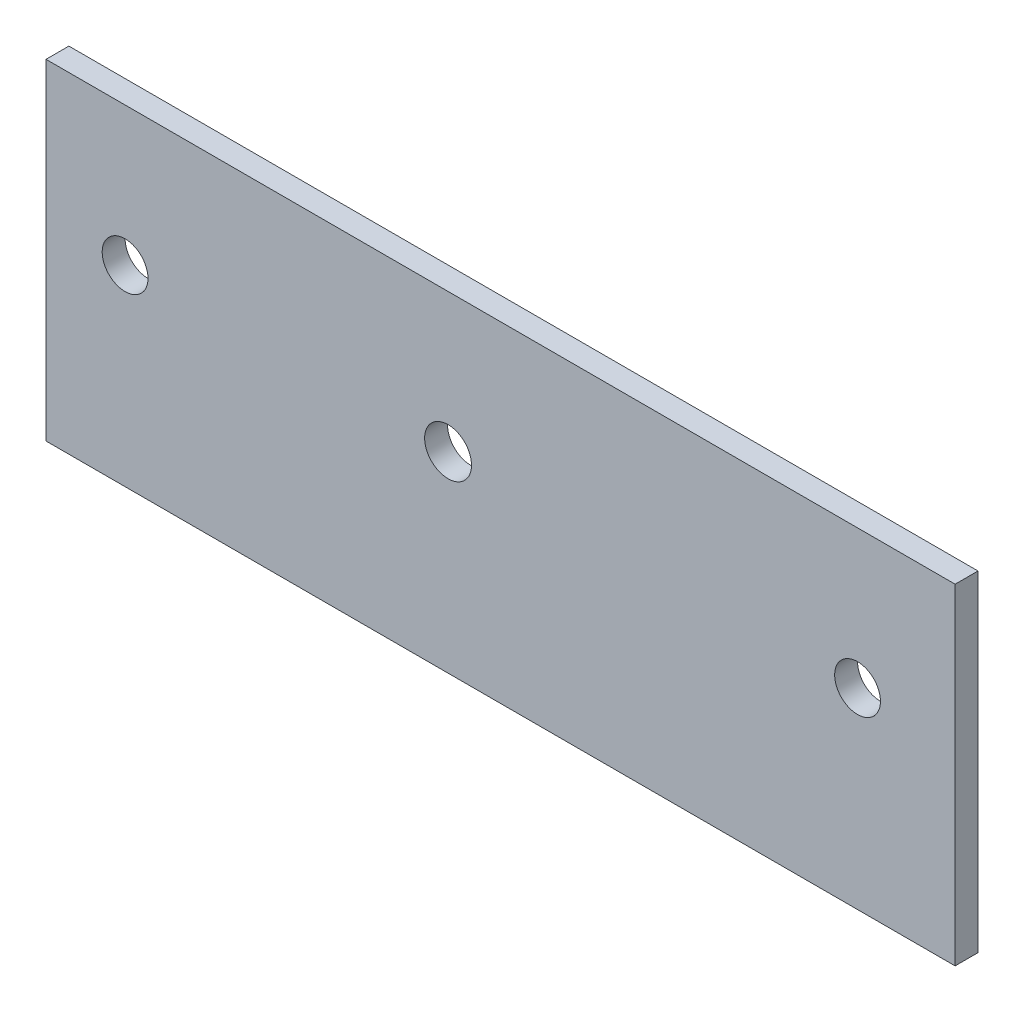
ISO-10303-21;
HEADER;
FILE_DESCRIPTION(('STEP AP214'),'2;1');
FILE_NAME('part.step','',(''),(''),'','','');
FILE_SCHEMA(('AUTOMOTIVE_DESIGN { 1 0 10303 214 1 1 1 1 }'));
ENDSEC;
DATA;
#1=APPLICATION_CONTEXT('core data for automotive mechanical design processes');
#2=APPLICATION_PROTOCOL_DEFINITION('international standard','automotive_design',2000,#1);
#3=PRODUCT_CONTEXT('',#1,'mechanical');
#4=PRODUCT('Part','Part','',(#3));
#5=PRODUCT_RELATED_PRODUCT_CATEGORY('part','',(#4));
#6=PRODUCT_DEFINITION_FORMATION('','',#4);
#7=PRODUCT_DEFINITION_CONTEXT('part definition',#1,'design');
#8=PRODUCT_DEFINITION('design','',#6,#7);
#9=PRODUCT_DEFINITION_SHAPE('','',#8);
#10=(LENGTH_UNIT() NAMED_UNIT(*) SI_UNIT(.MILLI.,.METRE.));
#11=(NAMED_UNIT(*) PLANE_ANGLE_UNIT() SI_UNIT($,.RADIAN.));
#12=(NAMED_UNIT(*) SI_UNIT($,.STERADIAN.) SOLID_ANGLE_UNIT());
#13=UNCERTAINTY_MEASURE_WITH_UNIT(LENGTH_MEASURE(1.E-05),#10,'distance_accuracy_value','');
#14=(GEOMETRIC_REPRESENTATION_CONTEXT(3) GLOBAL_UNCERTAINTY_ASSIGNED_CONTEXT((#13)) GLOBAL_UNIT_ASSIGNED_CONTEXT((#10,
#11,#12)) REPRESENTATION_CONTEXT('',''));
#15=CARTESIAN_POINT('',(0.,0.,0.));
#16=DIRECTION('',(0.,0.,1.));
#17=DIRECTION('',(1.,0.,0.));
#18=AXIS2_PLACEMENT_3D('',#15,#16,#17);
#19=CARTESIAN_POINT('',(0.,0.,3.175));
#20=DIRECTION('',(0.,0.,1.));
#21=DIRECTION('',(1.,0.,0.));
#22=AXIS2_PLACEMENT_3D('',#19,#20,#21);
#23=PLANE('',#22);
#24=CARTESIAN_POINT('',(76.2,5.55111512312578E-13,3.175));
#25=DIRECTION('',(0.,0.,1.));
#26=DIRECTION('',(1.,0.,0.));
#27=AXIS2_PLACEMENT_3D('',#24,#25,#26);
#28=CIRCLE('',#27,3.175);
#29=CARTESIAN_POINT('',(79.375,5.55111512312578E-13,3.175));
#30=VERTEX_POINT('',#29);
#31=EDGE_CURVE('E121',#30,#30,#28,.T.);
#32=ORIENTED_EDGE('',*,*,#31,.F.);
#33=EDGE_LOOP('',(#32));
#34=FACE_BOUND('',#33,.T.);
#35=DIRECTION('',(0.,-1.,0.));
#36=VECTOR('',#35,1.);
#37=CARTESIAN_POINT('',(-36.3707562658249,19.2466207447382,3.175));
#38=LINE('',#37,#36);
#39=CARTESIAN_POINT('',(-36.3707562658249,19.2466207447382,3.175));
#40=VERTEX_POINT('',#39);
#41=CARTESIAN_POINT('',(-36.3707562658249,-26.6095387948013,3.175));
#42=VERTEX_POINT('',#41);
#43=EDGE_CURVE('E91',#40,#42,#38,.T.);
#44=ORIENTED_EDGE('',*,*,#43,.T.);
#45=DIRECTION('',(1.,0.,0.));
#46=VECTOR('',#45,1.);
#47=CARTESIAN_POINT('',(-36.3707562658249,-26.6095387948013,3.175));
#48=LINE('',#47,#46);
#49=CARTESIAN_POINT('',(89.7342582038192,-26.6095387948013,3.175));
#50=VERTEX_POINT('',#49);
#51=EDGE_CURVE('E86',#42,#50,#48,.T.);
#52=ORIENTED_EDGE('',*,*,#51,.T.);
#53=DIRECTION('',(0.,1.,0.));
#54=VECTOR('',#53,1.);
#55=CARTESIAN_POINT('',(89.7342582038192,19.2466207447382,3.175));
#56=LINE('',#55,#54);
#57=CARTESIAN_POINT('',(89.7342582038192,19.2466207447382,3.175));
#58=VERTEX_POINT('',#57);
#59=EDGE_CURVE('E89',#50,#58,#56,.T.);
#60=ORIENTED_EDGE('',*,*,#59,.T.);
#61=DIRECTION('',(-1.,0.,0.));
#62=VECTOR('',#61,1.);
#63=CARTESIAN_POINT('',(-36.3707562658249,19.2466207447382,3.175));
#64=LINE('',#63,#62);
#65=EDGE_CURVE('E56',#58,#40,#64,.T.);
#66=ORIENTED_EDGE('',*,*,#65,.T.);
#67=EDGE_LOOP('',(#44,#52,#60,#66));
#68=FACE_BOUND('',#67,.T.);
#69=CARTESIAN_POINT('',(19.3993211431604,0.,3.175));
#70=DIRECTION('',(0.,0.,1.));
#71=DIRECTION('',(1.,0.,0.));
#72=AXIS2_PLACEMENT_3D('',#69,#70,#71);
#73=CIRCLE('',#72,3.2512);
#74=CARTESIAN_POINT('',(22.6505211431604,0.,3.175));
#75=VERTEX_POINT('',#74);
#76=EDGE_CURVE('E106',#75,#75,#73,.T.);
#77=ORIENTED_EDGE('',*,*,#76,.F.);
#78=EDGE_LOOP('',(#77));
#79=FACE_BOUND('',#78,.T.);
#80=CARTESIAN_POINT('',(-25.4,-2.22044604925031E-13,3.175));
#81=DIRECTION('',(0.,0.,1.));
#82=DIRECTION('',(1.,0.,0.));
#83=AXIS2_PLACEMENT_3D('',#80,#81,#82);
#84=CIRCLE('',#83,3.175);
#85=CARTESIAN_POINT('',(-22.225,-2.22044604925031E-13,3.175));
#86=VERTEX_POINT('',#85);
#87=EDGE_CURVE('E127',#86,#86,#84,.T.);
#88=ORIENTED_EDGE('',*,*,#87,.F.);
#89=EDGE_LOOP('',(#88));
#90=FACE_BOUND('',#89,.T.);
#91=ADVANCED_FACE('F39',(#34,#68,#79,#90),#23,.T.);
#92=CARTESIAN_POINT('',(0.,0.,0.));
#93=DIRECTION('',(0.,0.,1.));
#94=DIRECTION('',(1.,0.,0.));
#95=AXIS2_PLACEMENT_3D('',#92,#93,#94);
#96=PLANE('',#95);
#97=DIRECTION('',(0.,-1.,0.));
#98=VECTOR('',#97,1.);
#99=CARTESIAN_POINT('',(-36.3707562658249,19.2466207447382,0.));
#100=LINE('',#99,#98);
#101=CARTESIAN_POINT('',(-36.3707562658249,19.2466207447382,0.));
#102=VERTEX_POINT('',#101);
#103=CARTESIAN_POINT('',(-36.3707562658249,-26.6095387948013,0.));
#104=VERTEX_POINT('',#103);
#105=EDGE_CURVE('E103',#102,#104,#100,.T.);
#106=ORIENTED_EDGE('',*,*,#105,.F.);
#107=DIRECTION('',(-1.,0.,0.));
#108=VECTOR('',#107,1.);
#109=CARTESIAN_POINT('',(-36.3707562658249,19.2466207447382,0.));
#110=LINE('',#109,#108);
#111=CARTESIAN_POINT('',(89.7342582038192,19.2466207447382,0.));
#112=VERTEX_POINT('',#111);
#113=EDGE_CURVE('E79',#112,#102,#110,.T.);
#114=ORIENTED_EDGE('',*,*,#113,.F.);
#115=DIRECTION('',(0.,1.,0.));
#116=VECTOR('',#115,1.);
#117=CARTESIAN_POINT('',(89.7342582038192,19.2466207447382,0.));
#118=LINE('',#117,#116);
#119=CARTESIAN_POINT('',(89.7342582038192,-26.6095387948013,0.));
#120=VERTEX_POINT('',#119);
#121=EDGE_CURVE('E73',#120,#112,#118,.T.);
#122=ORIENTED_EDGE('',*,*,#121,.F.);
#123=DIRECTION('',(1.,0.,0.));
#124=VECTOR('',#123,1.);
#125=CARTESIAN_POINT('',(-36.3707562658249,-26.6095387948013,0.));
#126=LINE('',#125,#124);
#127=EDGE_CURVE('E95',#104,#120,#126,.T.);
#128=ORIENTED_EDGE('',*,*,#127,.F.);
#129=EDGE_LOOP('',(#106,#114,#122,#128));
#130=FACE_BOUND('',#129,.T.);
#131=CARTESIAN_POINT('',(19.3993211431604,0.,0.));
#132=DIRECTION('',(0.,0.,1.));
#133=DIRECTION('',(1.,0.,0.));
#134=AXIS2_PLACEMENT_3D('',#131,#132,#133);
#135=CIRCLE('',#134,3.2512);
#136=CARTESIAN_POINT('',(22.6505211431604,0.,0.));
#137=VERTEX_POINT('',#136);
#138=EDGE_CURVE('E118',#137,#137,#135,.T.);
#139=ORIENTED_EDGE('',*,*,#138,.T.);
#140=EDGE_LOOP('',(#139));
#141=FACE_BOUND('',#140,.T.);
#142=CARTESIAN_POINT('',(76.2,5.55111512312578E-13,0.));
#143=DIRECTION('',(0.,0.,1.));
#144=DIRECTION('',(1.,0.,0.));
#145=AXIS2_PLACEMENT_3D('',#142,#143,#144);
#146=CIRCLE('',#145,3.175);
#147=CARTESIAN_POINT('',(79.375,5.55111512312578E-13,0.));
#148=VERTEX_POINT('',#147);
#149=EDGE_CURVE('E124',#148,#148,#146,.T.);
#150=ORIENTED_EDGE('',*,*,#149,.T.);
#151=EDGE_LOOP('',(#150));
#152=FACE_BOUND('',#151,.T.);
#153=CARTESIAN_POINT('',(-25.4,-2.22044604925031E-13,0.));
#154=DIRECTION('',(0.,0.,1.));
#155=DIRECTION('',(1.,0.,0.));
#156=AXIS2_PLACEMENT_3D('',#153,#154,#155);
#157=CIRCLE('',#156,3.175);
#158=CARTESIAN_POINT('',(-22.225,-2.22044604925031E-13,0.));
#159=VERTEX_POINT('',#158);
#160=EDGE_CURVE('E130',#159,#159,#157,.T.);
#161=ORIENTED_EDGE('',*,*,#160,.T.);
#162=EDGE_LOOP('',(#161));
#163=FACE_BOUND('',#162,.T.);
#164=ADVANCED_FACE('F114',(#130,#141,#152,#163),#96,.F.);
#165=CARTESIAN_POINT('',(-36.3707562658249,19.2466207447382,3.175));
#166=DIRECTION('',(1.,0.,0.));
#167=DIRECTION('',(0.,0.,-1.));
#168=AXIS2_PLACEMENT_3D('',#165,#166,#167);
#169=PLANE('',#168);
#170=ORIENTED_EDGE('',*,*,#105,.T.);
#171=DIRECTION('',(0.,0.,-1.));
#172=VECTOR('',#171,1.);
#173=CARTESIAN_POINT('',(-36.3707562658249,-26.6095387948013,3.175));
#174=LINE('',#173,#172);
#175=EDGE_CURVE('E11',#42,#104,#174,.T.);
#176=ORIENTED_EDGE('',*,*,#175,.F.);
#177=ORIENTED_EDGE('',*,*,#43,.F.);
#178=DIRECTION('',(0.,0.,-1.));
#179=VECTOR('',#178,1.);
#180=CARTESIAN_POINT('',(-36.3707562658249,19.2466207447382,3.175));
#181=LINE('',#180,#179);
#182=EDGE_CURVE('E99',#40,#102,#181,.T.);
#183=ORIENTED_EDGE('',*,*,#182,.T.);
#184=EDGE_LOOP('',(#170,#176,#177,#183));
#185=FACE_BOUND('',#184,.T.);
#186=ADVANCED_FACE('F41',(#185),#169,.F.);
#187=CARTESIAN_POINT('',(-36.3707562658249,-26.6095387948013,3.175));
#188=DIRECTION('',(0.,1.,0.));
#189=DIRECTION('',(0.,0.,1.));
#190=AXIS2_PLACEMENT_3D('',#187,#188,#189);
#191=PLANE('',#190);
#192=ORIENTED_EDGE('',*,*,#127,.T.);
#193=DIRECTION('',(0.,0.,-1.));
#194=VECTOR('',#193,1.);
#195=CARTESIAN_POINT('',(89.7342582038192,-26.6095387948013,3.175));
#196=LINE('',#195,#194);
#197=EDGE_CURVE('E48',#50,#120,#196,.T.);
#198=ORIENTED_EDGE('',*,*,#197,.F.);
#199=ORIENTED_EDGE('',*,*,#51,.F.);
#200=ORIENTED_EDGE('',*,*,#175,.T.);
#201=EDGE_LOOP('',(#192,#198,#199,#200));
#202=FACE_BOUND('',#201,.T.);
#203=ADVANCED_FACE('F94',(#202),#191,.F.);
#204=CARTESIAN_POINT('',(89.7342582038192,19.2466207447382,3.175));
#205=DIRECTION('',(-1.,0.,0.));
#206=DIRECTION('',(0.,0.,1.));
#207=AXIS2_PLACEMENT_3D('',#204,#205,#206);
#208=PLANE('',#207);
#209=ORIENTED_EDGE('',*,*,#121,.T.);
#210=DIRECTION('',(0.,0.,-1.));
#211=VECTOR('',#210,1.);
#212=CARTESIAN_POINT('',(89.7342582038192,19.2466207447382,3.175));
#213=LINE('',#212,#211);
#214=EDGE_CURVE('E96',#58,#112,#213,.T.);
#215=ORIENTED_EDGE('',*,*,#214,.F.);
#216=ORIENTED_EDGE('',*,*,#59,.F.);
#217=ORIENTED_EDGE('',*,*,#197,.T.);
#218=EDGE_LOOP('',(#209,#215,#216,#217));
#219=FACE_BOUND('',#218,.T.);
#220=ADVANCED_FACE('F97',(#219),#208,.F.);
#221=CARTESIAN_POINT('',(-36.3707562658249,19.2466207447382,3.175));
#222=DIRECTION('',(0.,-1.,0.));
#223=DIRECTION('',(0.,0.,-1.));
#224=AXIS2_PLACEMENT_3D('',#221,#222,#223);
#225=PLANE('',#224);
#226=ORIENTED_EDGE('',*,*,#113,.T.);
#227=ORIENTED_EDGE('',*,*,#182,.F.);
#228=ORIENTED_EDGE('',*,*,#65,.F.);
#229=ORIENTED_EDGE('',*,*,#214,.T.);
#230=EDGE_LOOP('',(#226,#227,#228,#229));
#231=FACE_BOUND('',#230,.T.);
#232=ADVANCED_FACE('F111',(#231),#225,.F.);
#233=CARTESIAN_POINT('',(19.3993211431604,0.,3.175));
#234=DIRECTION('',(0.,0.,-1.));
#235=DIRECTION('',(-1.,0.,0.));
#236=AXIS2_PLACEMENT_3D('',#233,#234,#235);
#237=CYLINDRICAL_SURFACE('',#236,3.2512);
#238=ORIENTED_EDGE('',*,*,#76,.T.);
#239=EDGE_LOOP('',(#238));
#240=FACE_BOUND('',#239,.T.);
#241=ORIENTED_EDGE('',*,*,#138,.F.);
#242=EDGE_LOOP('',(#241));
#243=FACE_BOUND('',#242,.T.);
#244=ADVANCED_FACE('F148',(#240,#243),#237,.F.);
#245=CARTESIAN_POINT('',(76.2,5.55111512312578E-13,3.175));
#246=DIRECTION('',(0.,0.,-1.));
#247=DIRECTION('',(-1.,0.,0.));
#248=AXIS2_PLACEMENT_3D('',#245,#246,#247);
#249=CYLINDRICAL_SURFACE('',#248,3.175);
#250=ORIENTED_EDGE('',*,*,#31,.T.);
#251=EDGE_LOOP('',(#250));
#252=FACE_BOUND('',#251,.T.);
#253=ORIENTED_EDGE('',*,*,#149,.F.);
#254=EDGE_LOOP('',(#253));
#255=FACE_BOUND('',#254,.T.);
#256=ADVANCED_FACE('F193',(#252,#255),#249,.F.);
#257=CARTESIAN_POINT('',(-25.4,-2.22044604925031E-13,3.175));
#258=DIRECTION('',(0.,0.,-1.));
#259=DIRECTION('',(-1.,0.,0.));
#260=AXIS2_PLACEMENT_3D('',#257,#258,#259);
#261=CYLINDRICAL_SURFACE('',#260,3.175);
#262=ORIENTED_EDGE('',*,*,#87,.T.);
#263=EDGE_LOOP('',(#262));
#264=FACE_BOUND('',#263,.T.);
#265=ORIENTED_EDGE('',*,*,#160,.F.);
#266=EDGE_LOOP('',(#265));
#267=FACE_BOUND('',#266,.T.);
#268=ADVANCED_FACE('F136',(#264,#267),#261,.F.);
#269=CLOSED_SHELL('',(#91,#164,#186,#203,#220,#232,#244,#256,#268));
#270=MANIFOLD_SOLID_BREP('B2',#269);
#271=ADVANCED_BREP_SHAPE_REPRESENTATION('',(#18,#270),#14);
#272=SHAPE_DEFINITION_REPRESENTATION(#9,#271);
ENDSEC;
END-ISO-10303-21;
